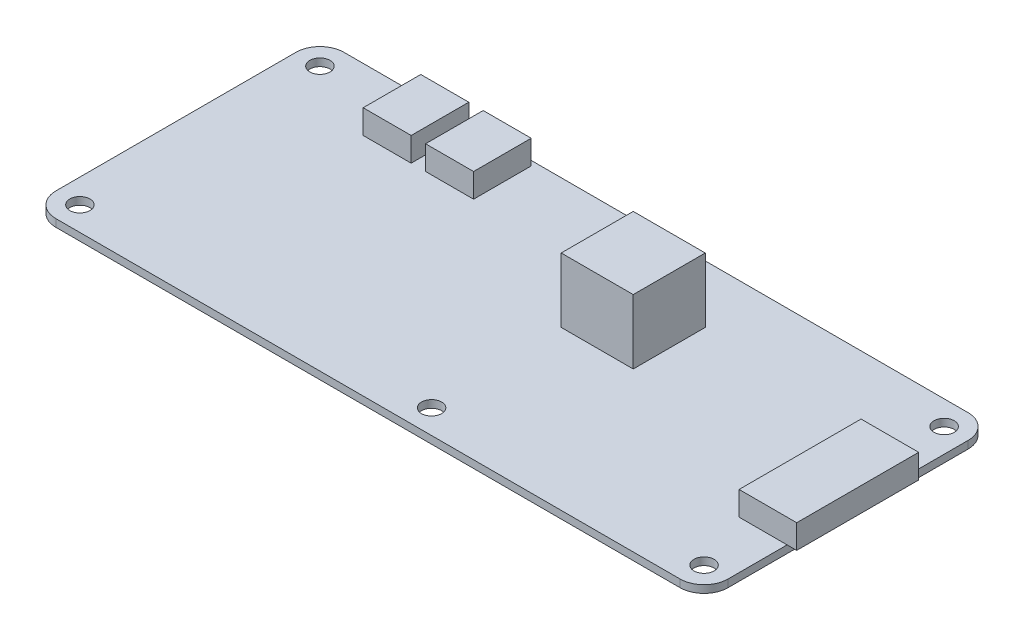
ISO-10303-21;
HEADER;
FILE_DESCRIPTION(('STEP AP214'),'2;1');
FILE_NAME('part.step','',(''),(''),'','','');
FILE_SCHEMA(('AUTOMOTIVE_DESIGN { 1 0 10303 214 1 1 1 1 }'));
ENDSEC;
DATA;
#1=APPLICATION_CONTEXT('core data for automotive mechanical design processes');
#2=APPLICATION_PROTOCOL_DEFINITION('international standard','automotive_design',2000,#1);
#3=PRODUCT_CONTEXT('',#1,'mechanical');
#4=PRODUCT('Part','Part','',(#3));
#5=PRODUCT_RELATED_PRODUCT_CATEGORY('part','',(#4));
#6=PRODUCT_DEFINITION_FORMATION('','',#4);
#7=PRODUCT_DEFINITION_CONTEXT('part definition',#1,'design');
#8=PRODUCT_DEFINITION('design','',#6,#7);
#9=PRODUCT_DEFINITION_SHAPE('','',#8);
#10=(LENGTH_UNIT() NAMED_UNIT(*) SI_UNIT(.MILLI.,.METRE.));
#11=(NAMED_UNIT(*) PLANE_ANGLE_UNIT() SI_UNIT($,.RADIAN.));
#12=(NAMED_UNIT(*) SI_UNIT($,.STERADIAN.) SOLID_ANGLE_UNIT());
#13=UNCERTAINTY_MEASURE_WITH_UNIT(LENGTH_MEASURE(1.E-05),#10,'distance_accuracy_value','');
#14=(GEOMETRIC_REPRESENTATION_CONTEXT(3) GLOBAL_UNCERTAINTY_ASSIGNED_CONTEXT((#13)) GLOBAL_UNIT_ASSIGNED_CONTEXT((#10,
#11,#12)) REPRESENTATION_CONTEXT('',''));
#15=CARTESIAN_POINT('',(0.,0.,0.));
#16=DIRECTION('',(0.,0.,1.));
#17=DIRECTION('',(1.,0.,0.));
#18=AXIS2_PLACEMENT_3D('',#15,#16,#17);
#19=CARTESIAN_POINT('',(5.,1.5748,-5.));
#20=DIRECTION('',(0.,1.,0.));
#21=DIRECTION('',(0.,0.,1.));
#22=AXIS2_PLACEMENT_3D('',#19,#20,#21);
#23=PLANE('',#22);
#24=CARTESIAN_POINT('',(78.2499999640001,1.5748,-55.));
#25=DIRECTION('',(0.,1.,0.));
#26=DIRECTION('',(0.,0.,1.));
#27=AXIS2_PLACEMENT_3D('',#24,#25,#26);
#28=CIRCLE('',#27,2.1);
#29=CARTESIAN_POINT('',(78.2499999640001,1.5748,-52.9));
#30=VERTEX_POINT('',#29);
#31=EDGE_CURVE('E345',#30,#30,#28,.T.);
#32=ORIENTED_EDGE('',*,*,#31,.F.);
#33=EDGE_LOOP('',(#32));
#34=FACE_BOUND('',#33,.T.);
#35=CARTESIAN_POINT('',(135.,1.5748,-5.));
#36=DIRECTION('',(0.,1.,0.));
#37=DIRECTION('',(0.,0.,1.));
#38=AXIS2_PLACEMENT_3D('',#35,#36,#37);
#39=CIRCLE('',#38,2.09999999999999);
#40=CARTESIAN_POINT('',(135.,1.5748,-2.90000000000001));
#41=VERTEX_POINT('',#40);
#42=EDGE_CURVE('E357',#41,#41,#39,.T.);
#43=ORIENTED_EDGE('',*,*,#42,.F.);
#44=EDGE_LOOP('',(#43));
#45=FACE_BOUND('',#44,.T.);
#46=CARTESIAN_POINT('',(5.,1.5748,-55.));
#47=DIRECTION('',(0.,1.,0.));
#48=DIRECTION('',(0.,0.,1.));
#49=AXIS2_PLACEMENT_3D('',#46,#47,#48);
#50=CIRCLE('',#49,2.1);
#51=CARTESIAN_POINT('',(5.,1.5748,-52.9));
#52=VERTEX_POINT('',#51);
#53=EDGE_CURVE('E369',#52,#52,#50,.T.);
#54=ORIENTED_EDGE('',*,*,#53,.F.);
#55=EDGE_LOOP('',(#54));
#56=FACE_BOUND('',#55,.T.);
#57=CARTESIAN_POINT('',(5.,1.5748,-5.));
#58=DIRECTION('',(0.,1.,0.));
#59=DIRECTION('',(0.,0.,1.));
#60=AXIS2_PLACEMENT_3D('',#57,#58,#59);
#61=CIRCLE('',#60,2.1);
#62=CARTESIAN_POINT('',(5.,1.5748,-2.9));
#63=VERTEX_POINT('',#62);
#64=EDGE_CURVE('E363',#63,#63,#61,.T.);
#65=ORIENTED_EDGE('',*,*,#64,.F.);
#66=EDGE_LOOP('',(#65));
#67=FACE_BOUND('',#66,.T.);
#68=CARTESIAN_POINT('',(135.,1.5748,-55.));
#69=DIRECTION('',(0.,1.,0.));
#70=DIRECTION('',(0.,0.,1.));
#71=AXIS2_PLACEMENT_3D('',#68,#69,#70);
#72=CIRCLE('',#71,2.09999999999999);
#73=CARTESIAN_POINT('',(135.,1.5748,-52.9));
#74=VERTEX_POINT('',#73);
#75=EDGE_CURVE('E351',#74,#74,#72,.T.);
#76=ORIENTED_EDGE('',*,*,#75,.F.);
#77=EDGE_LOOP('',(#76));
#78=FACE_BOUND('',#77,.T.);
#79=CARTESIAN_POINT('',(78.249999964,1.5748,-5.));
#80=DIRECTION('',(0.,1.,0.));
#81=DIRECTION('',(0.,0.,1.));
#82=AXIS2_PLACEMENT_3D('',#79,#80,#81);
#83=CIRCLE('',#82,2.1);
#84=CARTESIAN_POINT('',(78.249999964,1.5748,-2.9));
#85=VERTEX_POINT('',#84);
#86=EDGE_CURVE('E339',#85,#85,#83,.T.);
#87=ORIENTED_EDGE('',*,*,#86,.F.);
#88=EDGE_LOOP('',(#87));
#89=FACE_BOUND('',#88,.T.);
#90=DIRECTION('',(0.,0.,1.));
#91=VECTOR('',#90,1.);
#92=CARTESIAN_POINT('',(130.,1.5748,-42.7));
#93=LINE('',#92,#91);
#94=CARTESIAN_POINT('',(130.,1.5748,-42.7));
#95=VERTEX_POINT('',#94);
#96=CARTESIAN_POINT('',(130.,1.5748,-17.3));
#97=VERTEX_POINT('',#96);
#98=EDGE_CURVE('E308',#95,#97,#93,.T.);
#99=ORIENTED_EDGE('',*,*,#98,.F.);
#100=DIRECTION('',(1.,0.,0.));
#101=VECTOR('',#100,1.);
#102=CARTESIAN_POINT('',(130.,1.5748,-42.7));
#103=LINE('',#102,#101);
#104=CARTESIAN_POINT('',(140.,1.5748,-42.7));
#105=VERTEX_POINT('',#104);
#106=EDGE_CURVE('E316',#95,#105,#103,.T.);
#107=ORIENTED_EDGE('',*,*,#106,.T.);
#108=DIRECTION('',(0.,0.,-1.));
#109=VECTOR('',#108,1.);
#110=CARTESIAN_POINT('',(140.,1.5748,-5.00000000000004));
#111=LINE('',#110,#109);
#112=CARTESIAN_POINT('',(140.,1.5748,-55.));
#113=VERTEX_POINT('',#112);
#114=EDGE_CURVE('E383',#105,#113,#111,.T.);
#115=ORIENTED_EDGE('',*,*,#114,.T.);
#116=CARTESIAN_POINT('',(135.,1.5748,-55.));
#117=DIRECTION('',(0.,1.,0.));
#118=DIRECTION('',(0.,0.,1.));
#119=AXIS2_PLACEMENT_3D('',#116,#117,#118);
#120=CIRCLE('',#119,5.);
#121=CARTESIAN_POINT('',(135.,1.5748,-60.));
#122=VERTEX_POINT('',#121);
#123=EDGE_CURVE('E387',#113,#122,#120,.T.);
#124=ORIENTED_EDGE('',*,*,#123,.T.);
#125=DIRECTION('',(-1.,0.,0.));
#126=VECTOR('',#125,1.);
#127=CARTESIAN_POINT('',(5.00000000000004,1.5748,-60.));
#128=LINE('',#127,#126);
#129=CARTESIAN_POINT('',(5.00000000000004,1.5748,-60.));
#130=VERTEX_POINT('',#129);
#131=EDGE_CURVE('E390',#122,#130,#128,.T.);
#132=ORIENTED_EDGE('',*,*,#131,.T.);
#133=CARTESIAN_POINT('',(5.,1.5748,-55.));
#134=DIRECTION('',(0.,1.,0.));
#135=DIRECTION('',(0.,0.,1.));
#136=AXIS2_PLACEMENT_3D('',#133,#134,#135);
#137=CIRCLE('',#136,5.);
#138=CARTESIAN_POINT('',(0.,1.5748,-55.));
#139=VERTEX_POINT('',#138);
#140=EDGE_CURVE('E392',#130,#139,#137,.T.);
#141=ORIENTED_EDGE('',*,*,#140,.T.);
#142=DIRECTION('',(0.,0.,1.));
#143=VECTOR('',#142,1.);
#144=CARTESIAN_POINT('',(0.,1.5748,-5.00000000000004));
#145=LINE('',#144,#143);
#146=CARTESIAN_POINT('',(0.,1.5748,-5.00000000000004));
#147=VERTEX_POINT('',#146);
#148=EDGE_CURVE('E394',#139,#147,#145,.T.);
#149=ORIENTED_EDGE('',*,*,#148,.T.);
#150=CARTESIAN_POINT('',(5.,1.5748,-5.));
#151=DIRECTION('',(0.,1.,0.));
#152=DIRECTION('',(0.,0.,1.));
#153=AXIS2_PLACEMENT_3D('',#150,#151,#152);
#154=CIRCLE('',#153,5.);
#155=CARTESIAN_POINT('',(5.00000000000004,1.5748,0.));
#156=VERTEX_POINT('',#155);
#157=EDGE_CURVE('E375',#147,#156,#154,.T.);
#158=ORIENTED_EDGE('',*,*,#157,.T.);
#159=DIRECTION('',(1.,0.,0.));
#160=VECTOR('',#159,1.);
#161=CARTESIAN_POINT('',(5.00000000000004,1.5748,0.));
#162=LINE('',#161,#160);
#163=CARTESIAN_POINT('',(135.,1.5748,0.));
#164=VERTEX_POINT('',#163);
#165=EDGE_CURVE('E378',#156,#164,#162,.T.);
#166=ORIENTED_EDGE('',*,*,#165,.T.);
#167=CARTESIAN_POINT('',(135.,1.5748,-5.));
#168=DIRECTION('',(0.,1.,0.));
#169=DIRECTION('',(0.,0.,1.));
#170=AXIS2_PLACEMENT_3D('',#167,#168,#169);
#171=CIRCLE('',#170,5.);
#172=CARTESIAN_POINT('',(140.,1.5748,-5.00000000000004));
#173=VERTEX_POINT('',#172);
#174=EDGE_CURVE('E381',#164,#173,#171,.T.);
#175=ORIENTED_EDGE('',*,*,#174,.T.);
#176=CARTESIAN_POINT('',(140.,1.5748,-17.3));
#177=VERTEX_POINT('',#176);
#178=EDGE_CURVE('E384',#173,#177,#111,.T.);
#179=ORIENTED_EDGE('',*,*,#178,.T.);
#180=DIRECTION('',(1.,0.,0.));
#181=VECTOR('',#180,1.);
#182=CARTESIAN_POINT('',(130.,1.5748,-17.3));
#183=LINE('',#182,#181);
#184=EDGE_CURVE('E322',#97,#177,#183,.T.);
#185=ORIENTED_EDGE('',*,*,#184,.F.);
#186=EDGE_LOOP('',(#99,#107,#115,#124,#132,#141,#149,#158,#166,#175,#179,#185));
#187=FACE_BOUND('',#186,.T.);
#188=DIRECTION('',(0.,0.,1.));
#189=VECTOR('',#188,1.);
#190=CARTESIAN_POINT('',(32.,1.5748,-59.));
#191=LINE('',#190,#189);
#192=CARTESIAN_POINT('',(32.,1.5748,-59.));
#193=VERTEX_POINT('',#192);
#194=CARTESIAN_POINT('',(32.,1.5748,-47.));
#195=VERTEX_POINT('',#194);
#196=EDGE_CURVE('E289',#193,#195,#191,.T.);
#197=ORIENTED_EDGE('',*,*,#196,.T.);
#198=DIRECTION('',(1.,0.,0.));
#199=VECTOR('',#198,1.);
#200=CARTESIAN_POINT('',(22.,1.5748,-47.));
#201=LINE('',#200,#199);
#202=CARTESIAN_POINT('',(22.,1.5748,-47.));
#203=VERTEX_POINT('',#202);
#204=EDGE_CURVE('E292',#203,#195,#201,.T.);
#205=ORIENTED_EDGE('',*,*,#204,.F.);
#206=DIRECTION('',(0.,0.,1.));
#207=VECTOR('',#206,1.);
#208=CARTESIAN_POINT('',(22.,1.5748,-59.));
#209=LINE('',#208,#207);
#210=CARTESIAN_POINT('',(22.,1.5748,-59.));
#211=VERTEX_POINT('',#210);
#212=EDGE_CURVE('E283',#211,#203,#209,.T.);
#213=ORIENTED_EDGE('',*,*,#212,.F.);
#214=DIRECTION('',(1.,0.,0.));
#215=VECTOR('',#214,1.);
#216=CARTESIAN_POINT('',(22.,1.5748,-59.));
#217=LINE('',#216,#215);
#218=EDGE_CURVE('E285',#211,#193,#217,.T.);
#219=ORIENTED_EDGE('',*,*,#218,.T.);
#220=EDGE_LOOP('',(#197,#205,#213,#219));
#221=FACE_BOUND('',#220,.T.);
#222=DIRECTION('',(0.,0.,1.));
#223=VECTOR('',#222,1.);
#224=CARTESIAN_POINT('',(45.,1.5748,-59.));
#225=LINE('',#224,#223);
#226=CARTESIAN_POINT('',(45.,1.5748,-59.));
#227=VERTEX_POINT('',#226);
#228=CARTESIAN_POINT('',(45.,1.5748,-47.));
#229=VERTEX_POINT('',#228);
#230=EDGE_CURVE('E258',#227,#229,#225,.T.);
#231=ORIENTED_EDGE('',*,*,#230,.T.);
#232=DIRECTION('',(1.,0.,0.));
#233=VECTOR('',#232,1.);
#234=CARTESIAN_POINT('',(35.,1.5748,-47.));
#235=LINE('',#234,#233);
#236=CARTESIAN_POINT('',(35.,1.5748,-47.));
#237=VERTEX_POINT('',#236);
#238=EDGE_CURVE('E261',#237,#229,#235,.T.);
#239=ORIENTED_EDGE('',*,*,#238,.F.);
#240=DIRECTION('',(0.,0.,1.));
#241=VECTOR('',#240,1.);
#242=CARTESIAN_POINT('',(35.,1.5748,-59.));
#243=LINE('',#242,#241);
#244=CARTESIAN_POINT('',(35.,1.5748,-59.));
#245=VERTEX_POINT('',#244);
#246=EDGE_CURVE('E254',#245,#237,#243,.T.);
#247=ORIENTED_EDGE('',*,*,#246,.F.);
#248=DIRECTION('',(1.,0.,0.));
#249=VECTOR('',#248,1.);
#250=CARTESIAN_POINT('',(35.,1.5748,-59.));
#251=LINE('',#250,#249);
#252=EDGE_CURVE('E67',#245,#227,#251,.T.);
#253=ORIENTED_EDGE('',*,*,#252,.T.);
#254=EDGE_LOOP('',(#231,#239,#247,#253));
#255=FACE_BOUND('',#254,.T.);
#256=DIRECTION('',(1.,0.,0.));
#257=VECTOR('',#256,1.);
#258=CARTESIAN_POINT('',(77.2499999640001,1.5748,-33.));
#259=LINE('',#258,#257);
#260=CARTESIAN_POINT('',(77.2499999640001,1.5748,-33.));
#261=VERTEX_POINT('',#260);
#262=CARTESIAN_POINT('',(92.2499999640001,1.5748,-33.));
#263=VERTEX_POINT('',#262);
#264=EDGE_CURVE('E243',#261,#263,#259,.T.);
#265=ORIENTED_EDGE('',*,*,#264,.F.);
#266=DIRECTION('',(0.,0.,1.));
#267=VECTOR('',#266,1.);
#268=CARTESIAN_POINT('',(77.2499999640001,1.5748,-48.));
#269=LINE('',#268,#267);
#270=CARTESIAN_POINT('',(77.2499999640001,1.5748,-48.));
#271=VERTEX_POINT('',#270);
#272=EDGE_CURVE('E237',#271,#261,#269,.T.);
#273=ORIENTED_EDGE('',*,*,#272,.F.);
#274=DIRECTION('',(-1.,0.,0.));
#275=VECTOR('',#274,1.);
#276=CARTESIAN_POINT('',(77.2499999640001,1.5748,-48.));
#277=LINE('',#276,#275);
#278=CARTESIAN_POINT('',(92.2499999640001,1.5748,-48.));
#279=VERTEX_POINT('',#278);
#280=EDGE_CURVE('E217',#279,#271,#277,.T.);
#281=ORIENTED_EDGE('',*,*,#280,.F.);
#282=DIRECTION('',(0.,0.,-1.));
#283=VECTOR('',#282,1.);
#284=CARTESIAN_POINT('',(92.2499999640001,1.5748,-48.));
#285=LINE('',#284,#283);
#286=EDGE_CURVE('E59',#263,#279,#285,.T.);
#287=ORIENTED_EDGE('',*,*,#286,.F.);
#288=EDGE_LOOP('',(#265,#273,#281,#287));
#289=FACE_BOUND('',#288,.T.);
#290=ADVANCED_FACE('F44',(#34,#45,#56,#67,#78,#89,#187,#221,#255,#289),#23,.T.);
#291=CARTESIAN_POINT('',(5.,0.,-5.));
#292=DIRECTION('',(0.,1.,0.));
#293=DIRECTION('',(0.,0.,1.));
#294=AXIS2_PLACEMENT_3D('',#291,#292,#293);
#295=PLANE('',#294);
#296=CARTESIAN_POINT('',(5.,0.,-5.));
#297=DIRECTION('',(0.,1.,0.));
#298=DIRECTION('',(0.,0.,1.));
#299=AXIS2_PLACEMENT_3D('',#296,#297,#298);
#300=CIRCLE('',#299,5.);
#301=CARTESIAN_POINT('',(0.,0.,-5.00000000000004));
#302=VERTEX_POINT('',#301);
#303=CARTESIAN_POINT('',(5.00000000000004,0.,0.));
#304=VERTEX_POINT('',#303);
#305=EDGE_CURVE('E372',#302,#304,#300,.T.);
#306=ORIENTED_EDGE('',*,*,#305,.F.);
#307=DIRECTION('',(0.,0.,1.));
#308=VECTOR('',#307,1.);
#309=CARTESIAN_POINT('',(0.,0.,-5.00000000000004));
#310=LINE('',#309,#308);
#311=CARTESIAN_POINT('',(0.,0.,-55.));
#312=VERTEX_POINT('',#311);
#313=EDGE_CURVE('E379',#312,#302,#310,.T.);
#314=ORIENTED_EDGE('',*,*,#313,.F.);
#315=CARTESIAN_POINT('',(5.,0.,-55.));
#316=DIRECTION('',(0.,1.,0.));
#317=DIRECTION('',(0.,0.,1.));
#318=AXIS2_PLACEMENT_3D('',#315,#316,#317);
#319=CIRCLE('',#318,5.);
#320=CARTESIAN_POINT('',(5.00000000000004,0.,-60.));
#321=VERTEX_POINT('',#320);
#322=EDGE_CURVE('E409',#321,#312,#319,.T.);
#323=ORIENTED_EDGE('',*,*,#322,.F.);
#324=DIRECTION('',(-1.,0.,0.));
#325=VECTOR('',#324,1.);
#326=CARTESIAN_POINT('',(5.00000000000004,0.,-60.));
#327=LINE('',#326,#325);
#328=CARTESIAN_POINT('',(135.,0.,-60.));
#329=VERTEX_POINT('',#328);
#330=EDGE_CURVE('E407',#329,#321,#327,.T.);
#331=ORIENTED_EDGE('',*,*,#330,.F.);
#332=CARTESIAN_POINT('',(135.,0.,-55.));
#333=DIRECTION('',(0.,1.,0.));
#334=DIRECTION('',(0.,0.,1.));
#335=AXIS2_PLACEMENT_3D('',#332,#333,#334);
#336=CIRCLE('',#335,5.);
#337=CARTESIAN_POINT('',(140.,0.,-55.));
#338=VERTEX_POINT('',#337);
#339=EDGE_CURVE('E405',#338,#329,#336,.T.);
#340=ORIENTED_EDGE('',*,*,#339,.F.);
#341=DIRECTION('',(0.,0.,-1.));
#342=VECTOR('',#341,1.);
#343=CARTESIAN_POINT('',(140.,0.,-5.00000000000004));
#344=LINE('',#343,#342);
#345=CARTESIAN_POINT('',(140.,0.,-5.00000000000004));
#346=VERTEX_POINT('',#345);
#347=EDGE_CURVE('E403',#346,#338,#344,.T.);
#348=ORIENTED_EDGE('',*,*,#347,.F.);
#349=CARTESIAN_POINT('',(135.,0.,-5.));
#350=DIRECTION('',(0.,1.,0.));
#351=DIRECTION('',(0.,0.,1.));
#352=AXIS2_PLACEMENT_3D('',#349,#350,#351);
#353=CIRCLE('',#352,5.);
#354=CARTESIAN_POINT('',(135.,0.,0.));
#355=VERTEX_POINT('',#354);
#356=EDGE_CURVE('E401',#355,#346,#353,.T.);
#357=ORIENTED_EDGE('',*,*,#356,.F.);
#358=DIRECTION('',(1.,0.,0.));
#359=VECTOR('',#358,1.);
#360=CARTESIAN_POINT('',(5.00000000000004,0.,0.));
#361=LINE('',#360,#359);
#362=EDGE_CURVE('E399',#304,#355,#361,.T.);
#363=ORIENTED_EDGE('',*,*,#362,.F.);
#364=EDGE_LOOP('',(#306,#314,#323,#331,#340,#348,#357,#363));
#365=FACE_BOUND('',#364,.T.);
#366=CARTESIAN_POINT('',(5.,0.,-55.));
#367=DIRECTION('',(0.,1.,0.));
#368=DIRECTION('',(0.,0.,1.));
#369=AXIS2_PLACEMENT_3D('',#366,#367,#368);
#370=CIRCLE('',#369,2.1);
#371=CARTESIAN_POINT('',(5.,0.,-52.9));
#372=VERTEX_POINT('',#371);
#373=EDGE_CURVE('E366',#372,#372,#370,.T.);
#374=ORIENTED_EDGE('',*,*,#373,.T.);
#375=EDGE_LOOP('',(#374));
#376=FACE_BOUND('',#375,.T.);
#377=CARTESIAN_POINT('',(5.,0.,-5.));
#378=DIRECTION('',(0.,1.,0.));
#379=DIRECTION('',(0.,0.,1.));
#380=AXIS2_PLACEMENT_3D('',#377,#378,#379);
#381=CIRCLE('',#380,2.1);
#382=CARTESIAN_POINT('',(5.,0.,-2.9));
#383=VERTEX_POINT('',#382);
#384=EDGE_CURVE('E360',#383,#383,#381,.T.);
#385=ORIENTED_EDGE('',*,*,#384,.T.);
#386=EDGE_LOOP('',(#385));
#387=FACE_BOUND('',#386,.T.);
#388=CARTESIAN_POINT('',(135.,0.,-5.));
#389=DIRECTION('',(0.,1.,0.));
#390=DIRECTION('',(0.,0.,1.));
#391=AXIS2_PLACEMENT_3D('',#388,#389,#390);
#392=CIRCLE('',#391,2.09999999999999);
#393=CARTESIAN_POINT('',(135.,0.,-2.90000000000001));
#394=VERTEX_POINT('',#393);
#395=EDGE_CURVE('E354',#394,#394,#392,.T.);
#396=ORIENTED_EDGE('',*,*,#395,.T.);
#397=EDGE_LOOP('',(#396));
#398=FACE_BOUND('',#397,.T.);
#399=CARTESIAN_POINT('',(135.,0.,-55.));
#400=DIRECTION('',(0.,1.,0.));
#401=DIRECTION('',(0.,0.,1.));
#402=AXIS2_PLACEMENT_3D('',#399,#400,#401);
#403=CIRCLE('',#402,2.09999999999999);
#404=CARTESIAN_POINT('',(135.,0.,-52.9));
#405=VERTEX_POINT('',#404);
#406=EDGE_CURVE('E348',#405,#405,#403,.T.);
#407=ORIENTED_EDGE('',*,*,#406,.T.);
#408=EDGE_LOOP('',(#407));
#409=FACE_BOUND('',#408,.T.);
#410=CARTESIAN_POINT('',(78.2499999640001,0.,-55.));
#411=DIRECTION('',(0.,1.,0.));
#412=DIRECTION('',(0.,0.,1.));
#413=AXIS2_PLACEMENT_3D('',#410,#411,#412);
#414=CIRCLE('',#413,2.1);
#415=CARTESIAN_POINT('',(78.2499999640001,0.,-52.9));
#416=VERTEX_POINT('',#415);
#417=EDGE_CURVE('E342',#416,#416,#414,.T.);
#418=ORIENTED_EDGE('',*,*,#417,.T.);
#419=EDGE_LOOP('',(#418));
#420=FACE_BOUND('',#419,.T.);
#421=CARTESIAN_POINT('',(78.249999964,0.,-5.));
#422=DIRECTION('',(0.,1.,0.));
#423=DIRECTION('',(0.,0.,1.));
#424=AXIS2_PLACEMENT_3D('',#421,#422,#423);
#425=CIRCLE('',#424,2.1);
#426=CARTESIAN_POINT('',(78.249999964,0.,-2.9));
#427=VERTEX_POINT('',#426);
#428=EDGE_CURVE('E330',#427,#427,#425,.T.);
#429=ORIENTED_EDGE('',*,*,#428,.T.);
#430=EDGE_LOOP('',(#429));
#431=FACE_BOUND('',#430,.T.);
#432=ADVANCED_FACE('F439',(#365,#376,#387,#398,#409,#420,#431),#295,.F.);
#433=CARTESIAN_POINT('',(5.,1.5748,-5.));
#434=DIRECTION('',(0.,-1.,0.));
#435=DIRECTION('',(0.,0.,-1.));
#436=AXIS2_PLACEMENT_3D('',#433,#434,#435);
#437=CYLINDRICAL_SURFACE('',#436,5.);
#438=ORIENTED_EDGE('',*,*,#305,.T.);
#439=DIRECTION('',(0.,-1.,0.));
#440=VECTOR('',#439,1.);
#441=CARTESIAN_POINT('',(5.00000000000004,1.5748,0.));
#442=LINE('',#441,#440);
#443=EDGE_CURVE('E12',#156,#304,#442,.T.);
#444=ORIENTED_EDGE('',*,*,#443,.F.);
#445=ORIENTED_EDGE('',*,*,#157,.F.);
#446=DIRECTION('',(0.,-1.,0.));
#447=VECTOR('',#446,1.);
#448=CARTESIAN_POINT('',(0.,1.5748,-5.00000000000004));
#449=LINE('',#448,#447);
#450=EDGE_CURVE('E396',#147,#302,#449,.T.);
#451=ORIENTED_EDGE('',*,*,#450,.T.);
#452=EDGE_LOOP('',(#438,#444,#445,#451));
#453=FACE_BOUND('',#452,.T.);
#454=ADVANCED_FACE('F46',(#453),#437,.T.);
#455=CARTESIAN_POINT('',(5.00000000000004,1.5748,0.));
#456=DIRECTION('',(0.,0.,-1.));
#457=DIRECTION('',(-1.,0.,0.));
#458=AXIS2_PLACEMENT_3D('',#455,#456,#457);
#459=PLANE('',#458);
#460=ORIENTED_EDGE('',*,*,#362,.T.);
#461=DIRECTION('',(0.,-1.,0.));
#462=VECTOR('',#461,1.);
#463=CARTESIAN_POINT('',(135.,1.5748,0.));
#464=LINE('',#463,#462);
#465=EDGE_CURVE('E52',#164,#355,#464,.T.);
#466=ORIENTED_EDGE('',*,*,#465,.F.);
#467=ORIENTED_EDGE('',*,*,#165,.F.);
#468=ORIENTED_EDGE('',*,*,#443,.T.);
#469=EDGE_LOOP('',(#460,#466,#467,#468));
#470=FACE_BOUND('',#469,.T.);
#471=ADVANCED_FACE('F519',(#470),#459,.F.);
#472=CARTESIAN_POINT('',(135.,1.5748,-5.));
#473=DIRECTION('',(0.,-1.,0.));
#474=DIRECTION('',(0.,0.,-1.));
#475=AXIS2_PLACEMENT_3D('',#472,#473,#474);
#476=CYLINDRICAL_SURFACE('',#475,5.);
#477=ORIENTED_EDGE('',*,*,#356,.T.);
#478=DIRECTION('',(0.,-1.,0.));
#479=VECTOR('',#478,1.);
#480=CARTESIAN_POINT('',(140.,1.5748,-5.00000000000004));
#481=LINE('',#480,#479);
#482=EDGE_CURVE('E426',#173,#346,#481,.T.);
#483=ORIENTED_EDGE('',*,*,#482,.F.);
#484=ORIENTED_EDGE('',*,*,#174,.F.);
#485=ORIENTED_EDGE('',*,*,#465,.T.);
#486=EDGE_LOOP('',(#477,#483,#484,#485));
#487=FACE_BOUND('',#486,.T.);
#488=ADVANCED_FACE('F433',(#487),#476,.T.);
#489=CARTESIAN_POINT('',(140.,1.5748,-5.00000000000004));
#490=DIRECTION('',(-1.,0.,0.));
#491=DIRECTION('',(0.,0.,1.));
#492=AXIS2_PLACEMENT_3D('',#489,#490,#491);
#493=PLANE('',#492);
#494=ORIENTED_EDGE('',*,*,#347,.T.);
#495=DIRECTION('',(0.,-1.,0.));
#496=VECTOR('',#495,1.);
#497=CARTESIAN_POINT('',(140.,1.5748,-55.));
#498=LINE('',#497,#496);
#499=EDGE_CURVE('E423',#113,#338,#498,.T.);
#500=ORIENTED_EDGE('',*,*,#499,.F.);
#501=ORIENTED_EDGE('',*,*,#114,.F.);
#502=EDGE_CURVE('E388',#177,#105,#111,.T.);
#503=ORIENTED_EDGE('',*,*,#502,.F.);
#504=ORIENTED_EDGE('',*,*,#178,.F.);
#505=ORIENTED_EDGE('',*,*,#482,.T.);
#506=EDGE_LOOP('',(#494,#500,#501,#503,#504,#505));
#507=FACE_BOUND('',#506,.T.);
#508=ADVANCED_FACE('F445',(#507),#493,.F.);
#509=CARTESIAN_POINT('',(135.,1.5748,-55.));
#510=DIRECTION('',(0.,-1.,0.));
#511=DIRECTION('',(0.,0.,-1.));
#512=AXIS2_PLACEMENT_3D('',#509,#510,#511);
#513=CYLINDRICAL_SURFACE('',#512,5.);
#514=ORIENTED_EDGE('',*,*,#339,.T.);
#515=DIRECTION('',(0.,-1.,0.));
#516=VECTOR('',#515,1.);
#517=CARTESIAN_POINT('',(135.,1.5748,-60.));
#518=LINE('',#517,#516);
#519=EDGE_CURVE('E420',#122,#329,#518,.T.);
#520=ORIENTED_EDGE('',*,*,#519,.F.);
#521=ORIENTED_EDGE('',*,*,#123,.F.);
#522=ORIENTED_EDGE('',*,*,#499,.T.);
#523=EDGE_LOOP('',(#514,#520,#521,#522));
#524=FACE_BOUND('',#523,.T.);
#525=ADVANCED_FACE('F450',(#524),#513,.T.);
#526=CARTESIAN_POINT('',(5.00000000000004,1.5748,-60.));
#527=DIRECTION('',(0.,0.,1.));
#528=DIRECTION('',(1.,0.,0.));
#529=AXIS2_PLACEMENT_3D('',#526,#527,#528);
#530=PLANE('',#529);
#531=ORIENTED_EDGE('',*,*,#330,.T.);
#532=DIRECTION('',(0.,-1.,0.));
#533=VECTOR('',#532,1.);
#534=CARTESIAN_POINT('',(5.00000000000004,1.5748,-60.));
#535=LINE('',#534,#533);
#536=EDGE_CURVE('E417',#130,#321,#535,.T.);
#537=ORIENTED_EDGE('',*,*,#536,.F.);
#538=ORIENTED_EDGE('',*,*,#131,.F.);
#539=ORIENTED_EDGE('',*,*,#519,.T.);
#540=EDGE_LOOP('',(#531,#537,#538,#539));
#541=FACE_BOUND('',#540,.T.);
#542=ADVANCED_FACE('F509',(#541),#530,.F.);
#543=CARTESIAN_POINT('',(5.,1.5748,-55.));
#544=DIRECTION('',(0.,-1.,0.));
#545=DIRECTION('',(0.,0.,-1.));
#546=AXIS2_PLACEMENT_3D('',#543,#544,#545);
#547=CYLINDRICAL_SURFACE('',#546,5.);
#548=ORIENTED_EDGE('',*,*,#322,.T.);
#549=DIRECTION('',(0.,-1.,0.));
#550=VECTOR('',#549,1.);
#551=CARTESIAN_POINT('',(0.,1.5748,-55.));
#552=LINE('',#551,#550);
#553=EDGE_CURVE('E414',#139,#312,#552,.T.);
#554=ORIENTED_EDGE('',*,*,#553,.F.);
#555=ORIENTED_EDGE('',*,*,#140,.F.);
#556=ORIENTED_EDGE('',*,*,#536,.T.);
#557=EDGE_LOOP('',(#548,#554,#555,#556));
#558=FACE_BOUND('',#557,.T.);
#559=ADVANCED_FACE('F505',(#558),#547,.T.);
#560=CARTESIAN_POINT('',(0.,1.5748,-5.00000000000004));
#561=DIRECTION('',(1.,0.,0.));
#562=DIRECTION('',(0.,0.,-1.));
#563=AXIS2_PLACEMENT_3D('',#560,#561,#562);
#564=PLANE('',#563);
#565=ORIENTED_EDGE('',*,*,#313,.T.);
#566=ORIENTED_EDGE('',*,*,#450,.F.);
#567=ORIENTED_EDGE('',*,*,#148,.F.);
#568=ORIENTED_EDGE('',*,*,#553,.T.);
#569=EDGE_LOOP('',(#565,#566,#567,#568));
#570=FACE_BOUND('',#569,.T.);
#571=ADVANCED_FACE('F502',(#570),#564,.F.);
#572=CARTESIAN_POINT('',(5.,1.5748,-55.));
#573=DIRECTION('',(0.,-1.,0.));
#574=DIRECTION('',(0.,0.,-1.));
#575=AXIS2_PLACEMENT_3D('',#572,#573,#574);
#576=CYLINDRICAL_SURFACE('',#575,2.1);
#577=ORIENTED_EDGE('',*,*,#53,.T.);
#578=EDGE_LOOP('',(#577));
#579=FACE_BOUND('',#578,.T.);
#580=ORIENTED_EDGE('',*,*,#373,.F.);
#581=EDGE_LOOP('',(#580));
#582=FACE_BOUND('',#581,.T.);
#583=ADVANCED_FACE('F499',(#579,#582),#576,.F.);
#584=CARTESIAN_POINT('',(5.,1.5748,-5.));
#585=DIRECTION('',(0.,-1.,0.));
#586=DIRECTION('',(0.,0.,-1.));
#587=AXIS2_PLACEMENT_3D('',#584,#585,#586);
#588=CYLINDRICAL_SURFACE('',#587,2.1);
#589=ORIENTED_EDGE('',*,*,#64,.T.);
#590=EDGE_LOOP('',(#589));
#591=FACE_BOUND('',#590,.T.);
#592=ORIENTED_EDGE('',*,*,#384,.F.);
#593=EDGE_LOOP('',(#592));
#594=FACE_BOUND('',#593,.T.);
#595=ADVANCED_FACE('F765',(#591,#594),#588,.F.);
#596=CARTESIAN_POINT('',(135.,1.5748,-5.));
#597=DIRECTION('',(0.,-1.,0.));
#598=DIRECTION('',(0.,0.,-1.));
#599=AXIS2_PLACEMENT_3D('',#596,#597,#598);
#600=CYLINDRICAL_SURFACE('',#599,2.09999999999999);
#601=ORIENTED_EDGE('',*,*,#42,.T.);
#602=EDGE_LOOP('',(#601));
#603=FACE_BOUND('',#602,.T.);
#604=ORIENTED_EDGE('',*,*,#395,.F.);
#605=EDGE_LOOP('',(#604));
#606=FACE_BOUND('',#605,.T.);
#607=ADVANCED_FACE('F755',(#603,#606),#600,.F.);
#608=CARTESIAN_POINT('',(135.,1.5748,-55.));
#609=DIRECTION('',(0.,-1.,0.));
#610=DIRECTION('',(0.,0.,-1.));
#611=AXIS2_PLACEMENT_3D('',#608,#609,#610);
#612=CYLINDRICAL_SURFACE('',#611,2.09999999999999);
#613=ORIENTED_EDGE('',*,*,#75,.T.);
#614=EDGE_LOOP('',(#613));
#615=FACE_BOUND('',#614,.T.);
#616=ORIENTED_EDGE('',*,*,#406,.F.);
#617=EDGE_LOOP('',(#616));
#618=FACE_BOUND('',#617,.T.);
#619=ADVANCED_FACE('F745',(#615,#618),#612,.F.);
#620=CARTESIAN_POINT('',(78.2499999640001,1.5748,-55.));
#621=DIRECTION('',(0.,-1.,0.));
#622=DIRECTION('',(0.,0.,-1.));
#623=AXIS2_PLACEMENT_3D('',#620,#621,#622);
#624=CYLINDRICAL_SURFACE('',#623,2.1);
#625=ORIENTED_EDGE('',*,*,#31,.T.);
#626=EDGE_LOOP('',(#625));
#627=FACE_BOUND('',#626,.T.);
#628=ORIENTED_EDGE('',*,*,#417,.F.);
#629=EDGE_LOOP('',(#628));
#630=FACE_BOUND('',#629,.T.);
#631=ADVANCED_FACE('F735',(#627,#630),#624,.F.);
#632=CARTESIAN_POINT('',(78.249999964,1.5748,-5.));
#633=DIRECTION('',(0.,-1.,0.));
#634=DIRECTION('',(0.,0.,-1.));
#635=AXIS2_PLACEMENT_3D('',#632,#633,#634);
#636=CYLINDRICAL_SURFACE('',#635,2.1);
#637=ORIENTED_EDGE('',*,*,#86,.T.);
#638=EDGE_LOOP('',(#637));
#639=FACE_BOUND('',#638,.T.);
#640=ORIENTED_EDGE('',*,*,#428,.F.);
#641=EDGE_LOOP('',(#640));
#642=FACE_BOUND('',#641,.T.);
#643=ADVANCED_FACE('F725',(#639,#642),#636,.F.);
#644=CARTESIAN_POINT('',(130.,6.5748,-42.7));
#645=DIRECTION('',(0.,0.,-1.));
#646=DIRECTION('',(-1.,0.,0.));
#647=AXIS2_PLACEMENT_3D('',#644,#645,#646);
#648=PLANE('',#647);
#649=ORIENTED_EDGE('',*,*,#106,.F.);
#650=DIRECTION('',(0.,-1.,0.));
#651=VECTOR('',#650,1.);
#652=CARTESIAN_POINT('',(130.,6.5748,-42.7));
#653=LINE('',#652,#651);
#654=CARTESIAN_POINT('',(130.,6.5748,-42.7));
#655=VERTEX_POINT('',#654);
#656=EDGE_CURVE('E327',#655,#95,#653,.T.);
#657=ORIENTED_EDGE('',*,*,#656,.F.);
#658=DIRECTION('',(1.,0.,0.));
#659=VECTOR('',#658,1.);
#660=CARTESIAN_POINT('',(130.,6.5748,-42.7));
#661=LINE('',#660,#659);
#662=CARTESIAN_POINT('',(142.,6.5748,-42.7));
#663=VERTEX_POINT('',#662);
#664=EDGE_CURVE('E304',#655,#663,#661,.T.);
#665=ORIENTED_EDGE('',*,*,#664,.T.);
#666=DIRECTION('',(0.,-1.,0.));
#667=VECTOR('',#666,1.);
#668=CARTESIAN_POINT('',(142.,6.5748,-42.7));
#669=LINE('',#668,#667);
#670=CARTESIAN_POINT('',(142.,1.5748,-42.7));
#671=VERTEX_POINT('',#670);
#672=EDGE_CURVE('E315',#663,#671,#669,.T.);
#673=ORIENTED_EDGE('',*,*,#672,.T.);
#674=EDGE_CURVE('E295',#105,#671,#103,.T.);
#675=ORIENTED_EDGE('',*,*,#674,.F.);
#676=EDGE_LOOP('',(#649,#657,#665,#673,#675));
#677=FACE_BOUND('',#676,.T.);
#678=ADVANCED_FACE('F463',(#677),#648,.T.);
#679=CARTESIAN_POINT('',(130.,6.5748,-42.7));
#680=DIRECTION('',(1.,0.,0.));
#681=DIRECTION('',(0.,0.,-1.));
#682=AXIS2_PLACEMENT_3D('',#679,#680,#681);
#683=PLANE('',#682);
#684=ORIENTED_EDGE('',*,*,#98,.T.);
#685=DIRECTION('',(0.,-1.,0.));
#686=VECTOR('',#685,1.);
#687=CARTESIAN_POINT('',(130.,6.5748,-17.3));
#688=LINE('',#687,#686);
#689=CARTESIAN_POINT('',(130.,6.5748,-17.3));
#690=VERTEX_POINT('',#689);
#691=EDGE_CURVE('E331',#690,#97,#688,.T.);
#692=ORIENTED_EDGE('',*,*,#691,.F.);
#693=DIRECTION('',(0.,0.,1.));
#694=VECTOR('',#693,1.);
#695=CARTESIAN_POINT('',(130.,6.5748,-42.7));
#696=LINE('',#695,#694);
#697=EDGE_CURVE('E313',#655,#690,#696,.T.);
#698=ORIENTED_EDGE('',*,*,#697,.F.);
#699=ORIENTED_EDGE('',*,*,#656,.T.);
#700=EDGE_LOOP('',(#684,#692,#698,#699));
#701=FACE_BOUND('',#700,.T.);
#702=ADVANCED_FACE('F475',(#701),#683,.F.);
#703=CARTESIAN_POINT('',(130.,6.5748,-17.3));
#704=DIRECTION('',(0.,0.,-1.));
#705=DIRECTION('',(-1.,0.,0.));
#706=AXIS2_PLACEMENT_3D('',#703,#704,#705);
#707=PLANE('',#706);
#708=ORIENTED_EDGE('',*,*,#184,.T.);
#709=CARTESIAN_POINT('',(142.,1.5748,-17.3));
#710=VERTEX_POINT('',#709);
#711=EDGE_CURVE('E321',#177,#710,#183,.T.);
#712=ORIENTED_EDGE('',*,*,#711,.T.);
#713=DIRECTION('',(0.,-1.,0.));
#714=VECTOR('',#713,1.);
#715=CARTESIAN_POINT('',(142.,6.5748,-17.3));
#716=LINE('',#715,#714);
#717=CARTESIAN_POINT('',(142.,6.5748,-17.3));
#718=VERTEX_POINT('',#717);
#719=EDGE_CURVE('E334',#718,#710,#716,.T.);
#720=ORIENTED_EDGE('',*,*,#719,.F.);
#721=DIRECTION('',(1.,0.,0.));
#722=VECTOR('',#721,1.);
#723=CARTESIAN_POINT('',(130.,6.5748,-17.3));
#724=LINE('',#723,#722);
#725=EDGE_CURVE('E311',#690,#718,#724,.T.);
#726=ORIENTED_EDGE('',*,*,#725,.F.);
#727=ORIENTED_EDGE('',*,*,#691,.T.);
#728=EDGE_LOOP('',(#708,#712,#720,#726,#727));
#729=FACE_BOUND('',#728,.T.);
#730=ADVANCED_FACE('F472',(#729),#707,.F.);
#731=CARTESIAN_POINT('',(142.,6.5748,-42.7));
#732=DIRECTION('',(1.,0.,0.));
#733=DIRECTION('',(0.,0.,-1.));
#734=AXIS2_PLACEMENT_3D('',#731,#732,#733);
#735=PLANE('',#734);
#736=DIRECTION('',(0.,0.,1.));
#737=VECTOR('',#736,1.);
#738=CARTESIAN_POINT('',(142.,1.5748,-42.7));
#739=LINE('',#738,#737);
#740=EDGE_CURVE('E318',#671,#710,#739,.T.);
#741=ORIENTED_EDGE('',*,*,#740,.F.);
#742=ORIENTED_EDGE('',*,*,#672,.F.);
#743=DIRECTION('',(0.,0.,1.));
#744=VECTOR('',#743,1.);
#745=CARTESIAN_POINT('',(142.,6.5748,-42.7));
#746=LINE('',#745,#744);
#747=EDGE_CURVE('E307',#663,#718,#746,.T.);
#748=ORIENTED_EDGE('',*,*,#747,.T.);
#749=ORIENTED_EDGE('',*,*,#719,.T.);
#750=EDGE_LOOP('',(#741,#742,#748,#749));
#751=FACE_BOUND('',#750,.T.);
#752=ADVANCED_FACE('F468',(#751),#735,.T.);
#753=CARTESIAN_POINT('',(0.,6.5748,0.));
#754=DIRECTION('',(0.,-1.,0.));
#755=DIRECTION('',(0.,0.,-1.));
#756=AXIS2_PLACEMENT_3D('',#753,#754,#755);
#757=PLANE('',#756);
#758=ORIENTED_EDGE('',*,*,#664,.F.);
#759=ORIENTED_EDGE('',*,*,#697,.T.);
#760=ORIENTED_EDGE('',*,*,#725,.T.);
#761=ORIENTED_EDGE('',*,*,#747,.F.);
#762=EDGE_LOOP('',(#758,#759,#760,#761));
#763=FACE_BOUND('',#762,.T.);
#764=ADVANCED_FACE('F478',(#763),#757,.F.);
#765=CARTESIAN_POINT('',(0.,1.5748,0.));
#766=DIRECTION('',(0.,-1.,0.));
#767=DIRECTION('',(0.,0.,-1.));
#768=AXIS2_PLACEMENT_3D('',#765,#766,#767);
#769=PLANE('',#768);
#770=ORIENTED_EDGE('',*,*,#711,.F.);
#771=ORIENTED_EDGE('',*,*,#502,.T.);
#772=ORIENTED_EDGE('',*,*,#674,.T.);
#773=ORIENTED_EDGE('',*,*,#740,.T.);
#774=EDGE_LOOP('',(#770,#771,#772,#773));
#775=FACE_BOUND('',#774,.T.);
#776=ADVANCED_FACE('F461',(#775),#769,.T.);
#777=CARTESIAN_POINT('',(22.,6.5748,-47.));
#778=DIRECTION('',(0.,0.,-1.));
#779=DIRECTION('',(-1.,0.,0.));
#780=AXIS2_PLACEMENT_3D('',#777,#778,#779);
#781=PLANE('',#780);
#782=ORIENTED_EDGE('',*,*,#204,.T.);
#783=DIRECTION('',(0.,-1.,0.));
#784=VECTOR('',#783,1.);
#785=CARTESIAN_POINT('',(32.,6.5748,-47.));
#786=LINE('',#785,#784);
#787=CARTESIAN_POINT('',(32.,6.5748,-47.));
#788=VERTEX_POINT('',#787);
#789=EDGE_CURVE('E264',#788,#195,#786,.T.);
#790=ORIENTED_EDGE('',*,*,#789,.F.);
#791=DIRECTION('',(1.,0.,0.));
#792=VECTOR('',#791,1.);
#793=CARTESIAN_POINT('',(22.,6.5748,-47.));
#794=LINE('',#793,#792);
#795=CARTESIAN_POINT('',(22.,6.5748,-47.));
#796=VERTEX_POINT('',#795);
#797=EDGE_CURVE('E286',#796,#788,#794,.T.);
#798=ORIENTED_EDGE('',*,*,#797,.F.);
#799=DIRECTION('',(0.,-1.,0.));
#800=VECTOR('',#799,1.);
#801=CARTESIAN_POINT('',(22.,6.5748,-47.));
#802=LINE('',#801,#800);
#803=EDGE_CURVE('E279',#796,#203,#802,.T.);
#804=ORIENTED_EDGE('',*,*,#803,.T.);
#805=EDGE_LOOP('',(#782,#790,#798,#804));
#806=FACE_BOUND('',#805,.T.);
#807=ADVANCED_FACE('F485',(#806),#781,.F.);
#808=CARTESIAN_POINT('',(32.,6.5748,-59.));
#809=DIRECTION('',(1.,0.,0.));
#810=DIRECTION('',(0.,0.,-1.));
#811=AXIS2_PLACEMENT_3D('',#808,#809,#810);
#812=PLANE('',#811);
#813=ORIENTED_EDGE('',*,*,#196,.F.);
#814=DIRECTION('',(0.,-1.,0.));
#815=VECTOR('',#814,1.);
#816=CARTESIAN_POINT('',(32.,6.5748,-59.));
#817=LINE('',#816,#815);
#818=CARTESIAN_POINT('',(32.,6.5748,-59.));
#819=VERTEX_POINT('',#818);
#820=EDGE_CURVE('E274',#819,#193,#817,.T.);
#821=ORIENTED_EDGE('',*,*,#820,.F.);
#822=DIRECTION('',(0.,0.,1.));
#823=VECTOR('',#822,1.);
#824=CARTESIAN_POINT('',(32.,6.5748,-59.));
#825=LINE('',#824,#823);
#826=EDGE_CURVE('E300',#819,#788,#825,.T.);
#827=ORIENTED_EDGE('',*,*,#826,.T.);
#828=ORIENTED_EDGE('',*,*,#789,.T.);
#829=EDGE_LOOP('',(#813,#821,#827,#828));
#830=FACE_BOUND('',#829,.T.);
#831=ADVANCED_FACE('F670',(#830),#812,.T.);
#832=CARTESIAN_POINT('',(22.,6.5748,-59.));
#833=DIRECTION('',(0.,0.,-1.));
#834=DIRECTION('',(-1.,0.,0.));
#835=AXIS2_PLACEMENT_3D('',#832,#833,#834);
#836=PLANE('',#835);
#837=ORIENTED_EDGE('',*,*,#218,.F.);
#838=DIRECTION('',(0.,-1.,0.));
#839=VECTOR('',#838,1.);
#840=CARTESIAN_POINT('',(22.,6.5748,-59.));
#841=LINE('',#840,#839);
#842=CARTESIAN_POINT('',(22.,6.5748,-59.));
#843=VERTEX_POINT('',#842);
#844=EDGE_CURVE('E276',#843,#211,#841,.T.);
#845=ORIENTED_EDGE('',*,*,#844,.F.);
#846=DIRECTION('',(1.,0.,0.));
#847=VECTOR('',#846,1.);
#848=CARTESIAN_POINT('',(22.,6.5748,-59.));
#849=LINE('',#848,#847);
#850=EDGE_CURVE('E297',#843,#819,#849,.T.);
#851=ORIENTED_EDGE('',*,*,#850,.T.);
#852=ORIENTED_EDGE('',*,*,#820,.T.);
#853=EDGE_LOOP('',(#837,#845,#851,#852));
#854=FACE_BOUND('',#853,.T.);
#855=ADVANCED_FACE('F662',(#854),#836,.T.);
#856=CARTESIAN_POINT('',(22.,6.5748,-59.));
#857=DIRECTION('',(1.,0.,0.));
#858=DIRECTION('',(0.,0.,-1.));
#859=AXIS2_PLACEMENT_3D('',#856,#857,#858);
#860=PLANE('',#859);
#861=ORIENTED_EDGE('',*,*,#212,.T.);
#862=ORIENTED_EDGE('',*,*,#803,.F.);
#863=DIRECTION('',(0.,0.,1.));
#864=VECTOR('',#863,1.);
#865=CARTESIAN_POINT('',(22.,6.5748,-59.));
#866=LINE('',#865,#864);
#867=EDGE_CURVE('E282',#843,#796,#866,.T.);
#868=ORIENTED_EDGE('',*,*,#867,.F.);
#869=ORIENTED_EDGE('',*,*,#844,.T.);
#870=EDGE_LOOP('',(#861,#862,#868,#869));
#871=FACE_BOUND('',#870,.T.);
#872=ADVANCED_FACE('F655',(#871),#860,.F.);
#873=CARTESIAN_POINT('',(0.,6.5748,0.));
#874=DIRECTION('',(0.,-1.,0.));
#875=DIRECTION('',(0.,0.,-1.));
#876=AXIS2_PLACEMENT_3D('',#873,#874,#875);
#877=PLANE('',#876);
#878=ORIENTED_EDGE('',*,*,#797,.T.);
#879=ORIENTED_EDGE('',*,*,#826,.F.);
#880=ORIENTED_EDGE('',*,*,#850,.F.);
#881=ORIENTED_EDGE('',*,*,#867,.T.);
#882=EDGE_LOOP('',(#878,#879,#880,#881));
#883=FACE_BOUND('',#882,.T.);
#884=ADVANCED_FACE('F647',(#883),#877,.F.);
#885=CARTESIAN_POINT('',(35.,6.5748,-47.));
#886=DIRECTION('',(0.,0.,-1.));
#887=DIRECTION('',(-1.,0.,0.));
#888=AXIS2_PLACEMENT_3D('',#885,#886,#887);
#889=PLANE('',#888);
#890=ORIENTED_EDGE('',*,*,#238,.T.);
#891=DIRECTION('',(0.,-1.,0.));
#892=VECTOR('',#891,1.);
#893=CARTESIAN_POINT('',(45.,6.5748,-47.));
#894=LINE('',#893,#892);
#895=CARTESIAN_POINT('',(45.,6.5748,-47.));
#896=VERTEX_POINT('',#895);
#897=EDGE_CURVE('E231',#896,#229,#894,.T.);
#898=ORIENTED_EDGE('',*,*,#897,.F.);
#899=DIRECTION('',(1.,0.,0.));
#900=VECTOR('',#899,1.);
#901=CARTESIAN_POINT('',(35.,6.5748,-47.));
#902=LINE('',#901,#900);
#903=CARTESIAN_POINT('',(35.,6.5748,-47.));
#904=VERTEX_POINT('',#903);
#905=EDGE_CURVE('E256',#904,#896,#902,.T.);
#906=ORIENTED_EDGE('',*,*,#905,.F.);
#907=DIRECTION('',(0.,-1.,0.));
#908=VECTOR('',#907,1.);
#909=CARTESIAN_POINT('',(35.,6.5748,-47.));
#910=LINE('',#909,#908);
#911=EDGE_CURVE('E250',#904,#237,#910,.T.);
#912=ORIENTED_EDGE('',*,*,#911,.T.);
#913=EDGE_LOOP('',(#890,#898,#906,#912));
#914=FACE_BOUND('',#913,.T.);
#915=ADVANCED_FACE('F639',(#914),#889,.F.);
#916=CARTESIAN_POINT('',(45.,6.5748,-59.));
#917=DIRECTION('',(1.,0.,0.));
#918=DIRECTION('',(0.,0.,-1.));
#919=AXIS2_PLACEMENT_3D('',#916,#917,#918);
#920=PLANE('',#919);
#921=ORIENTED_EDGE('',*,*,#230,.F.);
#922=DIRECTION('',(0.,-1.,0.));
#923=VECTOR('',#922,1.);
#924=CARTESIAN_POINT('',(45.,6.5748,-59.));
#925=LINE('',#924,#923);
#926=CARTESIAN_POINT('',(45.,6.5748,-59.));
#927=VERTEX_POINT('',#926);
#928=EDGE_CURVE('E233',#927,#227,#925,.T.);
#929=ORIENTED_EDGE('',*,*,#928,.F.);
#930=DIRECTION('',(0.,0.,1.));
#931=VECTOR('',#930,1.);
#932=CARTESIAN_POINT('',(45.,6.5748,-59.));
#933=LINE('',#932,#931);
#934=EDGE_CURVE('E269',#927,#896,#933,.T.);
#935=ORIENTED_EDGE('',*,*,#934,.T.);
#936=ORIENTED_EDGE('',*,*,#897,.T.);
#937=EDGE_LOOP('',(#921,#929,#935,#936));
#938=FACE_BOUND('',#937,.T.);
#939=ADVANCED_FACE('F632',(#938),#920,.T.);
#940=CARTESIAN_POINT('',(35.,6.5748,-59.));
#941=DIRECTION('',(0.,0.,-1.));
#942=DIRECTION('',(-1.,0.,0.));
#943=AXIS2_PLACEMENT_3D('',#940,#941,#942);
#944=PLANE('',#943);
#945=ORIENTED_EDGE('',*,*,#252,.F.);
#946=DIRECTION('',(0.,-1.,0.));
#947=VECTOR('',#946,1.);
#948=CARTESIAN_POINT('',(35.,6.5748,-59.));
#949=LINE('',#948,#947);
#950=CARTESIAN_POINT('',(35.,6.5748,-59.));
#951=VERTEX_POINT('',#950);
#952=EDGE_CURVE('E248',#951,#245,#949,.T.);
#953=ORIENTED_EDGE('',*,*,#952,.F.);
#954=DIRECTION('',(1.,0.,0.));
#955=VECTOR('',#954,1.);
#956=CARTESIAN_POINT('',(35.,6.5748,-59.));
#957=LINE('',#956,#955);
#958=EDGE_CURVE('E266',#951,#927,#957,.T.);
#959=ORIENTED_EDGE('',*,*,#958,.T.);
#960=ORIENTED_EDGE('',*,*,#928,.T.);
#961=EDGE_LOOP('',(#945,#953,#959,#960));
#962=FACE_BOUND('',#961,.T.);
#963=ADVANCED_FACE('F625',(#962),#944,.T.);
#964=CARTESIAN_POINT('',(35.,6.5748,-59.));
#965=DIRECTION('',(1.,0.,0.));
#966=DIRECTION('',(0.,0.,-1.));
#967=AXIS2_PLACEMENT_3D('',#964,#965,#966);
#968=PLANE('',#967);
#969=ORIENTED_EDGE('',*,*,#246,.T.);
#970=ORIENTED_EDGE('',*,*,#911,.F.);
#971=DIRECTION('',(0.,0.,1.));
#972=VECTOR('',#971,1.);
#973=CARTESIAN_POINT('',(35.,6.5748,-59.));
#974=LINE('',#973,#972);
#975=EDGE_CURVE('E253',#951,#904,#974,.T.);
#976=ORIENTED_EDGE('',*,*,#975,.F.);
#977=ORIENTED_EDGE('',*,*,#952,.T.);
#978=EDGE_LOOP('',(#969,#970,#976,#977));
#979=FACE_BOUND('',#978,.T.);
#980=ADVANCED_FACE('F618',(#979),#968,.F.);
#981=CARTESIAN_POINT('',(0.,6.5748,0.));
#982=DIRECTION('',(0.,-1.,0.));
#983=DIRECTION('',(0.,0.,-1.));
#984=AXIS2_PLACEMENT_3D('',#981,#982,#983);
#985=PLANE('',#984);
#986=ORIENTED_EDGE('',*,*,#905,.T.);
#987=ORIENTED_EDGE('',*,*,#934,.F.);
#988=ORIENTED_EDGE('',*,*,#958,.F.);
#989=ORIENTED_EDGE('',*,*,#975,.T.);
#990=EDGE_LOOP('',(#986,#987,#988,#989));
#991=FACE_BOUND('',#990,.T.);
#992=ADVANCED_FACE('F554',(#991),#985,.F.);
#993=CARTESIAN_POINT('',(77.2499999640001,39.3628034355964,-48.));
#994=DIRECTION('',(1.,0.,0.));
#995=DIRECTION('',(0.,0.,-1.));
#996=AXIS2_PLACEMENT_3D('',#993,#994,#995);
#997=PLANE('',#996);
#998=DIRECTION('',(0.,0.,1.));
#999=VECTOR('',#998,1.);
#1000=CARTESIAN_POINT('',(77.2499999640001,15.,-48.));
#1001=LINE('',#1000,#999);
#1002=CARTESIAN_POINT('',(77.2499999640001,15.,-48.));
#1003=VERTEX_POINT('',#1002);
#1004=CARTESIAN_POINT('',(77.2499999640001,15.,-33.));
#1005=VERTEX_POINT('',#1004);
#1006=EDGE_CURVE('E226',#1003,#1005,#1001,.T.);
#1007=ORIENTED_EDGE('',*,*,#1006,.F.);
#1008=DIRECTION('',(0.,-1.,0.));
#1009=VECTOR('',#1008,1.);
#1010=CARTESIAN_POINT('',(77.2499999640001,39.3628034355964,-48.));
#1011=LINE('',#1010,#1009);
#1012=EDGE_CURVE('E222',#1003,#271,#1011,.T.);
#1013=ORIENTED_EDGE('',*,*,#1012,.T.);
#1014=ORIENTED_EDGE('',*,*,#272,.T.);
#1015=DIRECTION('',(0.,-1.,0.));
#1016=VECTOR('',#1015,1.);
#1017=CARTESIAN_POINT('',(77.2499999640001,39.3628034355964,-33.));
#1018=LINE('',#1017,#1016);
#1019=EDGE_CURVE('E241',#1005,#261,#1018,.T.);
#1020=ORIENTED_EDGE('',*,*,#1019,.F.);
#1021=EDGE_LOOP('',(#1007,#1013,#1014,#1020));
#1022=FACE_BOUND('',#1021,.T.);
#1023=ADVANCED_FACE('F558',(#1022),#997,.F.);
#1024=CARTESIAN_POINT('',(77.2499999640001,39.3628034355964,-33.));
#1025=DIRECTION('',(0.,0.,-1.));
#1026=DIRECTION('',(-1.,0.,0.));
#1027=AXIS2_PLACEMENT_3D('',#1024,#1025,#1026);
#1028=PLANE('',#1027);
#1029=DIRECTION('',(1.,0.,0.));
#1030=VECTOR('',#1029,1.);
#1031=CARTESIAN_POINT('',(77.2499999640001,15.,-33.));
#1032=LINE('',#1031,#1030);
#1033=CARTESIAN_POINT('',(92.2499999640001,15.,-33.));
#1034=VERTEX_POINT('',#1033);
#1035=EDGE_CURVE('E230',#1005,#1034,#1032,.T.);
#1036=ORIENTED_EDGE('',*,*,#1035,.F.);
#1037=ORIENTED_EDGE('',*,*,#1019,.T.);
#1038=ORIENTED_EDGE('',*,*,#264,.T.);
#1039=DIRECTION('',(0.,-1.,0.));
#1040=VECTOR('',#1039,1.);
#1041=CARTESIAN_POINT('',(92.2499999640001,39.3628034355964,-33.));
#1042=LINE('',#1041,#1040);
#1043=EDGE_CURVE('E244',#1034,#263,#1042,.T.);
#1044=ORIENTED_EDGE('',*,*,#1043,.F.);
#1045=EDGE_LOOP('',(#1036,#1037,#1038,#1044));
#1046=FACE_BOUND('',#1045,.T.);
#1047=ADVANCED_FACE('F563',(#1046),#1028,.F.);
#1048=CARTESIAN_POINT('',(92.2499999640001,39.3628034355964,-48.));
#1049=DIRECTION('',(-1.,0.,0.));
#1050=DIRECTION('',(0.,0.,1.));
#1051=AXIS2_PLACEMENT_3D('',#1048,#1049,#1050);
#1052=PLANE('',#1051);
#1053=DIRECTION('',(0.,0.,-1.));
#1054=VECTOR('',#1053,1.);
#1055=CARTESIAN_POINT('',(92.2499999640001,15.,-48.));
#1056=LINE('',#1055,#1054);
#1057=CARTESIAN_POINT('',(92.2499999640001,15.,-48.));
#1058=VERTEX_POINT('',#1057);
#1059=EDGE_CURVE('E212',#1034,#1058,#1056,.T.);
#1060=ORIENTED_EDGE('',*,*,#1059,.F.);
#1061=ORIENTED_EDGE('',*,*,#1043,.T.);
#1062=ORIENTED_EDGE('',*,*,#286,.T.);
#1063=DIRECTION('',(0.,-1.,0.));
#1064=VECTOR('',#1063,1.);
#1065=CARTESIAN_POINT('',(92.2499999640001,39.3628034355964,-48.));
#1066=LINE('',#1065,#1064);
#1067=EDGE_CURVE('E208',#1058,#279,#1066,.T.);
#1068=ORIENTED_EDGE('',*,*,#1067,.F.);
#1069=EDGE_LOOP('',(#1060,#1061,#1062,#1068));
#1070=FACE_BOUND('',#1069,.T.);
#1071=ADVANCED_FACE('F210',(#1070),#1052,.F.);
#1072=CARTESIAN_POINT('',(77.2499999640001,39.3628034355964,-48.));
#1073=DIRECTION('',(0.,0.,1.));
#1074=DIRECTION('',(1.,0.,0.));
#1075=AXIS2_PLACEMENT_3D('',#1072,#1073,#1074);
#1076=PLANE('',#1075);
#1077=DIRECTION('',(-1.,0.,0.));
#1078=VECTOR('',#1077,1.);
#1079=CARTESIAN_POINT('',(77.2499999640001,15.,-48.));
#1080=LINE('',#1079,#1078);
#1081=EDGE_CURVE('E220',#1058,#1003,#1080,.T.);
#1082=ORIENTED_EDGE('',*,*,#1081,.F.);
#1083=ORIENTED_EDGE('',*,*,#1067,.T.);
#1084=ORIENTED_EDGE('',*,*,#280,.T.);
#1085=ORIENTED_EDGE('',*,*,#1012,.F.);
#1086=EDGE_LOOP('',(#1082,#1083,#1084,#1085));
#1087=FACE_BOUND('',#1086,.T.);
#1088=ADVANCED_FACE('F221',(#1087),#1076,.F.);
#1089=CARTESIAN_POINT('',(5.,15.,-5.));
#1090=DIRECTION('',(0.,1.,0.));
#1091=DIRECTION('',(0.,0.,1.));
#1092=AXIS2_PLACEMENT_3D('',#1089,#1090,#1091);
#1093=PLANE('',#1092);
#1094=ORIENTED_EDGE('',*,*,#1081,.T.);
#1095=ORIENTED_EDGE('',*,*,#1006,.T.);
#1096=ORIENTED_EDGE('',*,*,#1035,.T.);
#1097=ORIENTED_EDGE('',*,*,#1059,.T.);
#1098=EDGE_LOOP('',(#1094,#1095,#1096,#1097));
#1099=FACE_BOUND('',#1098,.T.);
#1100=ADVANCED_FACE('F229',(#1099),#1093,.T.);
#1101=CLOSED_SHELL('',(#290,#432,#454,#471,#488,#508,#525,#542,#559,#571,#583,#595,#607,#619,
#631,#643,#678,#702,#730,#752,#764,#776,#807,#831,#855,#872,#884,#915,#939,#963,#980,#992,#1023,
#1047,#1071,#1088,#1100));
#1102=MANIFOLD_SOLID_BREP('B2',#1101);
#1103=ADVANCED_BREP_SHAPE_REPRESENTATION('',(#18,#1102),#14);
#1104=SHAPE_DEFINITION_REPRESENTATION(#9,#1103);
ENDSEC;
END-ISO-10303-21;
